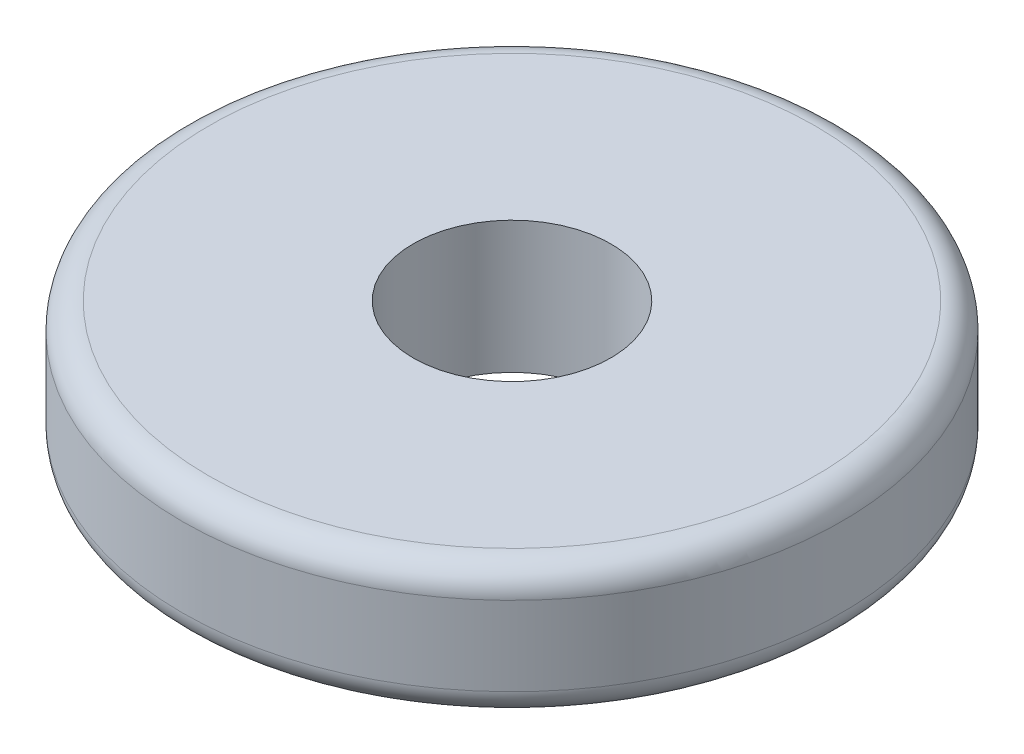
ISO-10303-21;
HEADER;
FILE_DESCRIPTION(('STEP AP214'),'2;1');
FILE_NAME('part.step','',(''),(''),'','','');
FILE_SCHEMA(('AUTOMOTIVE_DESIGN { 1 0 10303 214 1 1 1 1 }'));
ENDSEC;
DATA;
#1=APPLICATION_CONTEXT('core data for automotive mechanical design processes');
#2=APPLICATION_PROTOCOL_DEFINITION('international standard','automotive_design',2000,#1);
#3=PRODUCT_CONTEXT('',#1,'mechanical');
#4=PRODUCT('Part','Part','',(#3));
#5=PRODUCT_RELATED_PRODUCT_CATEGORY('part','',(#4));
#6=PRODUCT_DEFINITION_FORMATION('','',#4);
#7=PRODUCT_DEFINITION_CONTEXT('part definition',#1,'design');
#8=PRODUCT_DEFINITION('design','',#6,#7);
#9=PRODUCT_DEFINITION_SHAPE('','',#8);
#10=(LENGTH_UNIT() NAMED_UNIT(*) SI_UNIT(.MILLI.,.METRE.));
#11=(NAMED_UNIT(*) PLANE_ANGLE_UNIT() SI_UNIT($,.RADIAN.));
#12=(NAMED_UNIT(*) SI_UNIT($,.STERADIAN.) SOLID_ANGLE_UNIT());
#13=UNCERTAINTY_MEASURE_WITH_UNIT(LENGTH_MEASURE(1.E-05),#10,'distance_accuracy_value','');
#14=(GEOMETRIC_REPRESENTATION_CONTEXT(3) GLOBAL_UNCERTAINTY_ASSIGNED_CONTEXT((#13)) GLOBAL_UNIT_ASSIGNED_CONTEXT((#10,
#11,#12)) REPRESENTATION_CONTEXT('',''));
#15=CARTESIAN_POINT('',(0.,0.,0.));
#16=DIRECTION('',(0.,0.,1.));
#17=DIRECTION('',(1.,0.,0.));
#18=AXIS2_PLACEMENT_3D('',#15,#16,#17);
#19=CARTESIAN_POINT('',(0.,12.7,0.));
#20=DIRECTION('',(0.,1.,0.));
#21=DIRECTION('',(0.,0.,1.));
#22=AXIS2_PLACEMENT_3D('',#19,#20,#21);
#23=PLANE('',#22);
#24=CARTESIAN_POINT('',(0.,12.7,0.));
#25=DIRECTION('',(0.,1.,0.));
#26=DIRECTION('',(0.,0.,1.));
#27=AXIS2_PLACEMENT_3D('',#24,#25,#26);
#28=CIRCLE('',#27,29.21);
#29=CARTESIAN_POINT('',(0.,12.7,29.21));
#30=VERTEX_POINT('',#29);
#31=EDGE_CURVE('E10',#30,#30,#28,.T.);
#32=ORIENTED_EDGE('',*,*,#31,.T.);
#33=EDGE_LOOP('',(#32));
#34=FACE_BOUND('',#33,.T.);
#35=CARTESIAN_POINT('',(0.,12.7,0.));
#36=DIRECTION('',(0.,1.,0.));
#37=DIRECTION('',(0.,0.,1.));
#38=AXIS2_PLACEMENT_3D('',#35,#36,#37);
#39=CIRCLE('',#38,9.525);
#40=CARTESIAN_POINT('',(0.,12.7,9.525));
#41=VERTEX_POINT('',#40);
#42=EDGE_CURVE('E67',#41,#41,#39,.T.);
#43=ORIENTED_EDGE('',*,*,#42,.F.);
#44=EDGE_LOOP('',(#43));
#45=FACE_BOUND('',#44,.T.);
#46=ADVANCED_FACE('F43',(#34,#45),#23,.T.);
#47=CARTESIAN_POINT('',(0.,0.,0.));
#48=DIRECTION('',(0.,1.,0.));
#49=DIRECTION('',(0.,0.,1.));
#50=AXIS2_PLACEMENT_3D('',#47,#48,#49);
#51=PLANE('',#50);
#52=CARTESIAN_POINT('',(0.,0.,0.));
#53=DIRECTION('',(0.,1.,0.));
#54=DIRECTION('',(0.,0.,1.));
#55=AXIS2_PLACEMENT_3D('',#52,#53,#54);
#56=CIRCLE('',#55,29.21);
#57=CARTESIAN_POINT('',(0.,0.,29.21));
#58=VERTEX_POINT('',#57);
#59=EDGE_CURVE('E51',#58,#58,#56,.F.);
#60=ORIENTED_EDGE('',*,*,#59,.T.);
#61=EDGE_LOOP('',(#60));
#62=FACE_BOUND('',#61,.T.);
#63=CARTESIAN_POINT('',(0.,0.,0.));
#64=DIRECTION('',(0.,1.,0.));
#65=DIRECTION('',(0.,0.,1.));
#66=AXIS2_PLACEMENT_3D('',#63,#64,#65);
#67=CIRCLE('',#66,9.525);
#68=CARTESIAN_POINT('',(0.,0.,9.525));
#69=VERTEX_POINT('',#68);
#70=EDGE_CURVE('E68',#69,#69,#67,.T.);
#71=ORIENTED_EDGE('',*,*,#70,.T.);
#72=EDGE_LOOP('',(#71));
#73=FACE_BOUND('',#72,.T.);
#74=ADVANCED_FACE('F80',(#62,#73),#51,.F.);
#75=CARTESIAN_POINT('',(0.,12.7,0.));
#76=DIRECTION('',(0.,-1.,0.));
#77=DIRECTION('',(0.,0.,-1.));
#78=AXIS2_PLACEMENT_3D('',#75,#76,#77);
#79=CYLINDRICAL_SURFACE('',#78,31.75);
#80=CARTESIAN_POINT('',(0.,2.54,0.));
#81=DIRECTION('',(0.,1.,0.));
#82=DIRECTION('',(0.,0.,1.));
#83=AXIS2_PLACEMENT_3D('',#80,#81,#82);
#84=CIRCLE('',#83,31.75);
#85=CARTESIAN_POINT('',(0.,2.54,31.75));
#86=VERTEX_POINT('',#85);
#87=EDGE_CURVE('E56',#86,#86,#84,.T.);
#88=ORIENTED_EDGE('',*,*,#87,.T.);
#89=EDGE_LOOP('',(#88));
#90=FACE_BOUND('',#89,.T.);
#91=CARTESIAN_POINT('',(0.,10.16,0.));
#92=DIRECTION('',(0.,1.,0.));
#93=DIRECTION('',(0.,0.,1.));
#94=AXIS2_PLACEMENT_3D('',#91,#92,#93);
#95=CIRCLE('',#94,31.75);
#96=CARTESIAN_POINT('',(0.,10.16,31.75));
#97=VERTEX_POINT('',#96);
#98=EDGE_CURVE('E61',#97,#97,#95,.F.);
#99=ORIENTED_EDGE('',*,*,#98,.T.);
#100=EDGE_LOOP('',(#99));
#101=FACE_BOUND('',#100,.T.);
#102=ADVANCED_FACE('F86',(#90,#101),#79,.T.);
#103=CARTESIAN_POINT('',(0.,12.7,0.));
#104=DIRECTION('',(0.,-1.,0.));
#105=DIRECTION('',(0.,0.,-1.));
#106=AXIS2_PLACEMENT_3D('',#103,#104,#105);
#107=CYLINDRICAL_SURFACE('',#106,9.525);
#108=ORIENTED_EDGE('',*,*,#42,.T.);
#109=EDGE_LOOP('',(#108));
#110=FACE_BOUND('',#109,.T.);
#111=ORIENTED_EDGE('',*,*,#70,.F.);
#112=EDGE_LOOP('',(#111));
#113=FACE_BOUND('',#112,.T.);
#114=ADVANCED_FACE('F76',(#110,#113),#107,.F.);
#115=CARTESIAN_POINT('',(0.,2.54,0.));
#116=DIRECTION('',(0.,1.,0.));
#117=DIRECTION('',(0.,0.,1.));
#118=AXIS2_PLACEMENT_3D('',#115,#116,#117);
#119=TOROIDAL_SURFACE('',#118,29.21,2.54);
#120=ORIENTED_EDGE('',*,*,#59,.F.);
#121=EDGE_LOOP('',(#120));
#122=FACE_BOUND('',#121,.T.);
#123=ORIENTED_EDGE('',*,*,#87,.F.);
#124=EDGE_LOOP('',(#123));
#125=FACE_BOUND('',#124,.T.);
#126=ADVANCED_FACE('F92',(#122,#125),#119,.T.);
#127=CARTESIAN_POINT('',(0.,10.16,0.));
#128=DIRECTION('',(0.,1.,0.));
#129=DIRECTION('',(0.,0.,1.));
#130=AXIS2_PLACEMENT_3D('',#127,#128,#129);
#131=TOROIDAL_SURFACE('',#130,29.21,2.54);
#132=ORIENTED_EDGE('',*,*,#98,.F.);
#133=EDGE_LOOP('',(#132));
#134=FACE_BOUND('',#133,.T.);
#135=ORIENTED_EDGE('',*,*,#31,.F.);
#136=EDGE_LOOP('',(#135));
#137=FACE_BOUND('',#136,.T.);
#138=ADVANCED_FACE('F45',(#134,#137),#131,.T.);
#139=CLOSED_SHELL('',(#46,#74,#102,#114,#126,#138));
#140=MANIFOLD_SOLID_BREP('B2',#139);
#141=ADVANCED_BREP_SHAPE_REPRESENTATION('',(#18,#140),#14);
#142=SHAPE_DEFINITION_REPRESENTATION(#9,#141);
ENDSEC;
END-ISO-10303-21;
